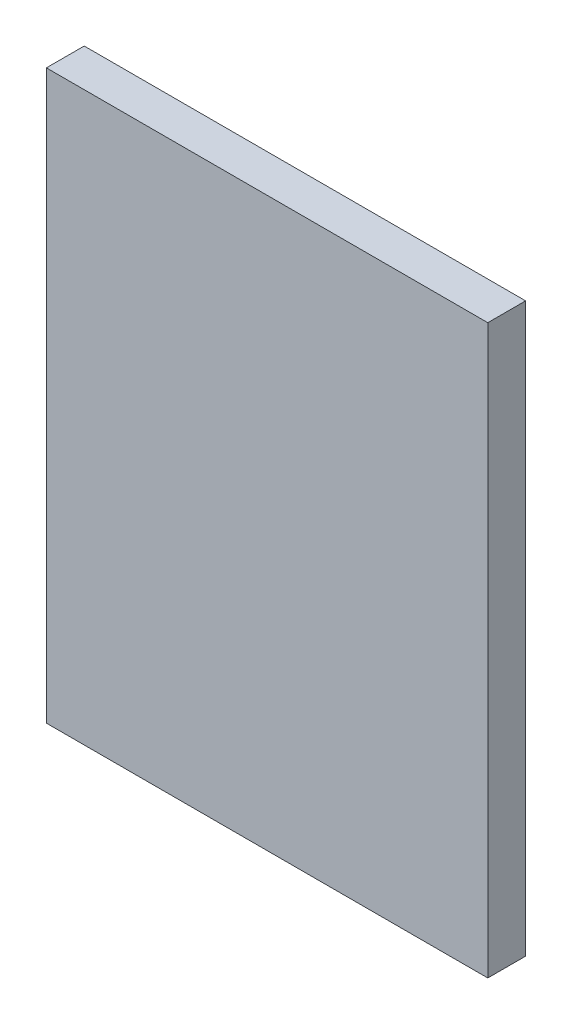
ISO-10303-21;
HEADER;
FILE_DESCRIPTION(('STEP AP214'),'2;1');
FILE_NAME('part.step','',(''),(''),'','','');
FILE_SCHEMA(('AUTOMOTIVE_DESIGN { 1 0 10303 214 1 1 1 1 }'));
ENDSEC;
DATA;
#1=APPLICATION_CONTEXT('core data for automotive mechanical design processes');
#2=APPLICATION_PROTOCOL_DEFINITION('international standard','automotive_design',2000,#1);
#3=PRODUCT_CONTEXT('',#1,'mechanical');
#4=PRODUCT('Part','Part','',(#3));
#5=PRODUCT_RELATED_PRODUCT_CATEGORY('part','',(#4));
#6=PRODUCT_DEFINITION_FORMATION('','',#4);
#7=PRODUCT_DEFINITION_CONTEXT('part definition',#1,'design');
#8=PRODUCT_DEFINITION('design','',#6,#7);
#9=PRODUCT_DEFINITION_SHAPE('','',#8);
#10=(LENGTH_UNIT() NAMED_UNIT(*) SI_UNIT(.MILLI.,.METRE.));
#11=(NAMED_UNIT(*) PLANE_ANGLE_UNIT() SI_UNIT($,.RADIAN.));
#12=(NAMED_UNIT(*) SI_UNIT($,.STERADIAN.) SOLID_ANGLE_UNIT());
#13=UNCERTAINTY_MEASURE_WITH_UNIT(LENGTH_MEASURE(1.E-05),#10,'distance_accuracy_value','');
#14=(GEOMETRIC_REPRESENTATION_CONTEXT(3) GLOBAL_UNCERTAINTY_ASSIGNED_CONTEXT((#13)) GLOBAL_UNIT_ASSIGNED_CONTEXT((#10,
#11,#12)) REPRESENTATION_CONTEXT('',''));
#15=CARTESIAN_POINT('',(0.,0.,0.));
#16=DIRECTION('',(0.,0.,1.));
#17=DIRECTION('',(1.,0.,0.));
#18=AXIS2_PLACEMENT_3D('',#15,#16,#17);
#19=CARTESIAN_POINT('',(-17.5,22.5,3.));
#20=DIRECTION('',(1.,0.,0.));
#21=DIRECTION('',(0.,1.,0.));
#22=AXIS2_PLACEMENT_3D('',#19,#20,#21);
#23=PLANE('',#22);
#24=DIRECTION('',(0.,-1.,0.));
#25=VECTOR('',#24,1.);
#26=CARTESIAN_POINT('',(-17.5,22.5,0.));
#27=LINE('',#26,#25);
#28=CARTESIAN_POINT('',(-17.5,22.5,0.));
#29=VERTEX_POINT('',#28);
#30=CARTESIAN_POINT('',(-17.5,-22.5,0.));
#31=VERTEX_POINT('',#30);
#32=EDGE_CURVE('E102',#29,#31,#27,.T.);
#33=ORIENTED_EDGE('',*,*,#32,.T.);
#34=DIRECTION('',(0.,0.,-1.));
#35=VECTOR('',#34,1.);
#36=CARTESIAN_POINT('',(-17.5,-22.5,3.));
#37=LINE('',#36,#35);
#38=CARTESIAN_POINT('',(-17.5,-22.5,3.));
#39=VERTEX_POINT('',#38);
#40=EDGE_CURVE('E11',#39,#31,#37,.T.);
#41=ORIENTED_EDGE('',*,*,#40,.F.);
#42=DIRECTION('',(0.,-1.,0.));
#43=VECTOR('',#42,1.);
#44=CARTESIAN_POINT('',(-17.5,22.5,3.));
#45=LINE('',#44,#43);
#46=CARTESIAN_POINT('',(-17.5,22.5,3.));
#47=VERTEX_POINT('',#46);
#48=EDGE_CURVE('E90',#47,#39,#45,.T.);
#49=ORIENTED_EDGE('',*,*,#48,.F.);
#50=DIRECTION('',(0.,0.,-1.));
#51=VECTOR('',#50,1.);
#52=CARTESIAN_POINT('',(-17.5,22.5,3.));
#53=LINE('',#52,#51);
#54=EDGE_CURVE('E98',#47,#29,#53,.T.);
#55=ORIENTED_EDGE('',*,*,#54,.T.);
#56=EDGE_LOOP('',(#33,#41,#49,#55));
#57=FACE_BOUND('',#56,.T.);
#58=ADVANCED_FACE('F39',(#57),#23,.F.);
#59=CARTESIAN_POINT('',(17.5,-22.5,3.));
#60=DIRECTION('',(0.,1.,0.));
#61=DIRECTION('',(-1.,0.,0.));
#62=AXIS2_PLACEMENT_3D('',#59,#60,#61);
#63=PLANE('',#62);
#64=DIRECTION('',(1.,0.,0.));
#65=VECTOR('',#64,1.);
#66=CARTESIAN_POINT('',(17.5,-22.5,0.));
#67=LINE('',#66,#65);
#68=CARTESIAN_POINT('',(17.5,-22.5,0.));
#69=VERTEX_POINT('',#68);
#70=EDGE_CURVE('E94',#31,#69,#67,.T.);
#71=ORIENTED_EDGE('',*,*,#70,.T.);
#72=DIRECTION('',(0.,0.,-1.));
#73=VECTOR('',#72,1.);
#74=CARTESIAN_POINT('',(17.5,-22.5,3.));
#75=LINE('',#74,#73);
#76=CARTESIAN_POINT('',(17.5,-22.5,3.));
#77=VERTEX_POINT('',#76);
#78=EDGE_CURVE('E47',#77,#69,#75,.T.);
#79=ORIENTED_EDGE('',*,*,#78,.F.);
#80=DIRECTION('',(1.,0.,0.));
#81=VECTOR('',#80,1.);
#82=CARTESIAN_POINT('',(17.5,-22.5,3.));
#83=LINE('',#82,#81);
#84=EDGE_CURVE('E85',#39,#77,#83,.T.);
#85=ORIENTED_EDGE('',*,*,#84,.F.);
#86=ORIENTED_EDGE('',*,*,#40,.T.);
#87=EDGE_LOOP('',(#71,#79,#85,#86));
#88=FACE_BOUND('',#87,.T.);
#89=ADVANCED_FACE('F93',(#88),#63,.F.);
#90=CARTESIAN_POINT('',(17.5,22.5,3.));
#91=DIRECTION('',(-1.,0.,0.));
#92=DIRECTION('',(0.,-1.,0.));
#93=AXIS2_PLACEMENT_3D('',#90,#91,#92);
#94=PLANE('',#93);
#95=DIRECTION('',(0.,1.,0.));
#96=VECTOR('',#95,1.);
#97=CARTESIAN_POINT('',(17.5,22.5,0.));
#98=LINE('',#97,#96);
#99=CARTESIAN_POINT('',(17.5,22.5,0.));
#100=VERTEX_POINT('',#99);
#101=EDGE_CURVE('E72',#69,#100,#98,.T.);
#102=ORIENTED_EDGE('',*,*,#101,.T.);
#103=DIRECTION('',(0.,0.,-1.));
#104=VECTOR('',#103,1.);
#105=CARTESIAN_POINT('',(17.5,22.5,3.));
#106=LINE('',#105,#104);
#107=CARTESIAN_POINT('',(17.5,22.5,3.));
#108=VERTEX_POINT('',#107);
#109=EDGE_CURVE('E95',#108,#100,#106,.T.);
#110=ORIENTED_EDGE('',*,*,#109,.F.);
#111=DIRECTION('',(0.,1.,0.));
#112=VECTOR('',#111,1.);
#113=CARTESIAN_POINT('',(17.5,22.5,3.));
#114=LINE('',#113,#112);
#115=EDGE_CURVE('E88',#77,#108,#114,.T.);
#116=ORIENTED_EDGE('',*,*,#115,.F.);
#117=ORIENTED_EDGE('',*,*,#78,.T.);
#118=EDGE_LOOP('',(#102,#110,#116,#117));
#119=FACE_BOUND('',#118,.T.);
#120=ADVANCED_FACE('F96',(#119),#94,.F.);
#121=CARTESIAN_POINT('',(17.5,22.5,3.));
#122=DIRECTION('',(0.,-1.,0.));
#123=DIRECTION('',(0.,0.,-1.));
#124=AXIS2_PLACEMENT_3D('',#121,#122,#123);
#125=PLANE('',#124);
#126=DIRECTION('',(-1.,0.,0.));
#127=VECTOR('',#126,1.);
#128=CARTESIAN_POINT('',(17.5,22.5,0.));
#129=LINE('',#128,#127);
#130=EDGE_CURVE('E78',#100,#29,#129,.T.);
#131=ORIENTED_EDGE('',*,*,#130,.T.);
#132=ORIENTED_EDGE('',*,*,#54,.F.);
#133=DIRECTION('',(-1.,0.,0.));
#134=VECTOR('',#133,1.);
#135=CARTESIAN_POINT('',(17.5,22.5,3.));
#136=LINE('',#135,#134);
#137=EDGE_CURVE('E55',#108,#47,#136,.T.);
#138=ORIENTED_EDGE('',*,*,#137,.F.);
#139=ORIENTED_EDGE('',*,*,#109,.T.);
#140=EDGE_LOOP('',(#131,#132,#138,#139));
#141=FACE_BOUND('',#140,.T.);
#142=ADVANCED_FACE('F109',(#141),#125,.F.);
#143=CARTESIAN_POINT('',(0.,0.,3.));
#144=DIRECTION('',(0.,0.,-1.));
#145=DIRECTION('',(-1.,0.,0.));
#146=AXIS2_PLACEMENT_3D('',#143,#144,#145);
#147=PLANE('',#146);
#148=ORIENTED_EDGE('',*,*,#48,.T.);
#149=ORIENTED_EDGE('',*,*,#84,.T.);
#150=ORIENTED_EDGE('',*,*,#115,.T.);
#151=ORIENTED_EDGE('',*,*,#137,.T.);
#152=EDGE_LOOP('',(#148,#149,#150,#151));
#153=FACE_BOUND('',#152,.T.);
#154=ADVANCED_FACE('F86',(#153),#147,.F.);
#155=CARTESIAN_POINT('',(0.,0.,0.));
#156=DIRECTION('',(0.,0.,-1.));
#157=DIRECTION('',(-1.,0.,0.));
#158=AXIS2_PLACEMENT_3D('',#155,#156,#157);
#159=PLANE('',#158);
#160=ORIENTED_EDGE('',*,*,#32,.F.);
#161=ORIENTED_EDGE('',*,*,#130,.F.);
#162=ORIENTED_EDGE('',*,*,#101,.F.);
#163=ORIENTED_EDGE('',*,*,#70,.F.);
#164=EDGE_LOOP('',(#160,#161,#162,#163));
#165=FACE_BOUND('',#164,.T.);
#166=ADVANCED_FACE('F112',(#165),#159,.T.);
#167=CLOSED_SHELL('',(#58,#89,#120,#142,#154,#166));
#168=MANIFOLD_SOLID_BREP('B2',#167);
#169=ADVANCED_BREP_SHAPE_REPRESENTATION('',(#18,#168),#14);
#170=SHAPE_DEFINITION_REPRESENTATION(#9,#169);
ENDSEC;
END-ISO-10303-21;
